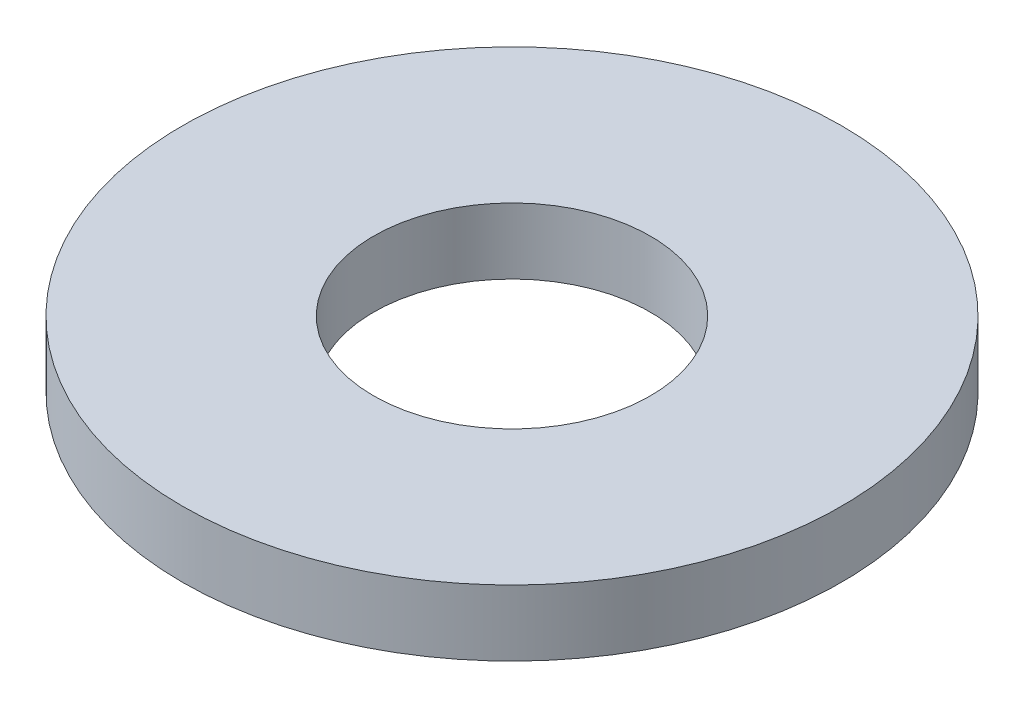
ISO-10303-21;
HEADER;
FILE_DESCRIPTION(('STEP AP214'),'2;1');
FILE_NAME('part.step','',(''),(''),'','','');
FILE_SCHEMA(('AUTOMOTIVE_DESIGN { 1 0 10303 214 1 1 1 1 }'));
ENDSEC;
DATA;
#1=APPLICATION_CONTEXT('core data for automotive mechanical design processes');
#2=APPLICATION_PROTOCOL_DEFINITION('international standard','automotive_design',2000,#1);
#3=PRODUCT_CONTEXT('',#1,'mechanical');
#4=PRODUCT('Part','Part','',(#3));
#5=PRODUCT_RELATED_PRODUCT_CATEGORY('part','',(#4));
#6=PRODUCT_DEFINITION_FORMATION('','',#4);
#7=PRODUCT_DEFINITION_CONTEXT('part definition',#1,'design');
#8=PRODUCT_DEFINITION('design','',#6,#7);
#9=PRODUCT_DEFINITION_SHAPE('','',#8);
#10=(LENGTH_UNIT() NAMED_UNIT(*) SI_UNIT(.MILLI.,.METRE.));
#11=(NAMED_UNIT(*) PLANE_ANGLE_UNIT() SI_UNIT($,.RADIAN.));
#12=(NAMED_UNIT(*) SI_UNIT($,.STERADIAN.) SOLID_ANGLE_UNIT());
#13=UNCERTAINTY_MEASURE_WITH_UNIT(LENGTH_MEASURE(1.E-05),#10,'distance_accuracy_value','');
#14=(GEOMETRIC_REPRESENTATION_CONTEXT(3) GLOBAL_UNCERTAINTY_ASSIGNED_CONTEXT((#13)) GLOBAL_UNIT_ASSIGNED_CONTEXT((#10,
#11,#12)) REPRESENTATION_CONTEXT('',''));
#15=CARTESIAN_POINT('',(0.,0.,0.));
#16=DIRECTION('',(0.,0.,1.));
#17=DIRECTION('',(1.,0.,0.));
#18=AXIS2_PLACEMENT_3D('',#15,#16,#17);
#19=CARTESIAN_POINT('',(0.,1.,0.));
#20=DIRECTION('',(0.,-1.,0.));
#21=DIRECTION('',(0.,0.,-1.));
#22=AXIS2_PLACEMENT_3D('',#19,#20,#21);
#23=CYLINDRICAL_SURFACE('',#22,5.);
#24=CARTESIAN_POINT('',(0.,1.,0.));
#25=DIRECTION('',(0.,1.,0.));
#26=DIRECTION('',(0.,0.,1.));
#27=AXIS2_PLACEMENT_3D('',#24,#25,#26);
#28=CIRCLE('',#27,5.);
#29=CARTESIAN_POINT('',(0.,1.,5.));
#30=VERTEX_POINT('',#29);
#31=EDGE_CURVE('E10',#30,#30,#28,.T.);
#32=ORIENTED_EDGE('',*,*,#31,.F.);
#33=EDGE_LOOP('',(#32));
#34=FACE_BOUND('',#33,.T.);
#35=CARTESIAN_POINT('',(0.,0.,0.));
#36=DIRECTION('',(0.,1.,0.));
#37=DIRECTION('',(0.,0.,1.));
#38=AXIS2_PLACEMENT_3D('',#35,#36,#37);
#39=CIRCLE('',#38,5.);
#40=CARTESIAN_POINT('',(0.,0.,5.));
#41=VERTEX_POINT('',#40);
#42=EDGE_CURVE('E42',#41,#41,#39,.T.);
#43=ORIENTED_EDGE('',*,*,#42,.T.);
#44=EDGE_LOOP('',(#43));
#45=FACE_BOUND('',#44,.T.);
#46=ADVANCED_FACE('F39',(#34,#45),#23,.T.);
#47=CARTESIAN_POINT('',(0.,1.,0.));
#48=DIRECTION('',(0.,1.,0.));
#49=DIRECTION('',(0.,0.,1.));
#50=AXIS2_PLACEMENT_3D('',#47,#48,#49);
#51=PLANE('',#50);
#52=CARTESIAN_POINT('',(0.,1.,0.));
#53=DIRECTION('',(0.,1.,0.));
#54=DIRECTION('',(0.,0.,1.));
#55=AXIS2_PLACEMENT_3D('',#52,#53,#54);
#56=CIRCLE('',#55,2.1);
#57=CARTESIAN_POINT('',(0.,1.,2.1));
#58=VERTEX_POINT('',#57);
#59=EDGE_CURVE('E51',#58,#58,#56,.T.);
#60=ORIENTED_EDGE('',*,*,#59,.F.);
#61=EDGE_LOOP('',(#60));
#62=FACE_BOUND('',#61,.T.);
#63=ORIENTED_EDGE('',*,*,#31,.T.);
#64=EDGE_LOOP('',(#63));
#65=FACE_BOUND('',#64,.T.);
#66=ADVANCED_FACE('F66',(#62,#65),#51,.T.);
#67=CARTESIAN_POINT('',(0.,0.,0.));
#68=DIRECTION('',(0.,1.,0.));
#69=DIRECTION('',(0.,0.,1.));
#70=AXIS2_PLACEMENT_3D('',#67,#68,#69);
#71=PLANE('',#70);
#72=CARTESIAN_POINT('',(0.,0.,0.));
#73=DIRECTION('',(0.,1.,0.));
#74=DIRECTION('',(0.,0.,1.));
#75=AXIS2_PLACEMENT_3D('',#72,#73,#74);
#76=CIRCLE('',#75,2.1);
#77=CARTESIAN_POINT('',(0.,0.,2.1));
#78=VERTEX_POINT('',#77);
#79=EDGE_CURVE('E49',#78,#78,#76,.T.);
#80=ORIENTED_EDGE('',*,*,#79,.T.);
#81=EDGE_LOOP('',(#80));
#82=FACE_BOUND('',#81,.T.);
#83=ORIENTED_EDGE('',*,*,#42,.F.);
#84=EDGE_LOOP('',(#83));
#85=FACE_BOUND('',#84,.T.);
#86=ADVANCED_FACE('F57',(#82,#85),#71,.F.);
#87=CARTESIAN_POINT('',(0.,0.,0.));
#88=DIRECTION('',(0.,1.,0.));
#89=DIRECTION('',(0.,0.,1.));
#90=AXIS2_PLACEMENT_3D('',#87,#88,#89);
#91=CYLINDRICAL_SURFACE('',#90,2.1);
#92=ORIENTED_EDGE('',*,*,#79,.F.);
#93=EDGE_LOOP('',(#92));
#94=FACE_BOUND('',#93,.T.);
#95=ORIENTED_EDGE('',*,*,#59,.T.);
#96=EDGE_LOOP('',(#95));
#97=FACE_BOUND('',#96,.T.);
#98=ADVANCED_FACE('F60',(#94,#97),#91,.F.);
#99=CLOSED_SHELL('',(#46,#66,#86,#98));
#100=MANIFOLD_SOLID_BREP('B2',#99);
#101=ADVANCED_BREP_SHAPE_REPRESENTATION('',(#18,#100),#14);
#102=SHAPE_DEFINITION_REPRESENTATION(#9,#101);
ENDSEC;
END-ISO-10303-21;
